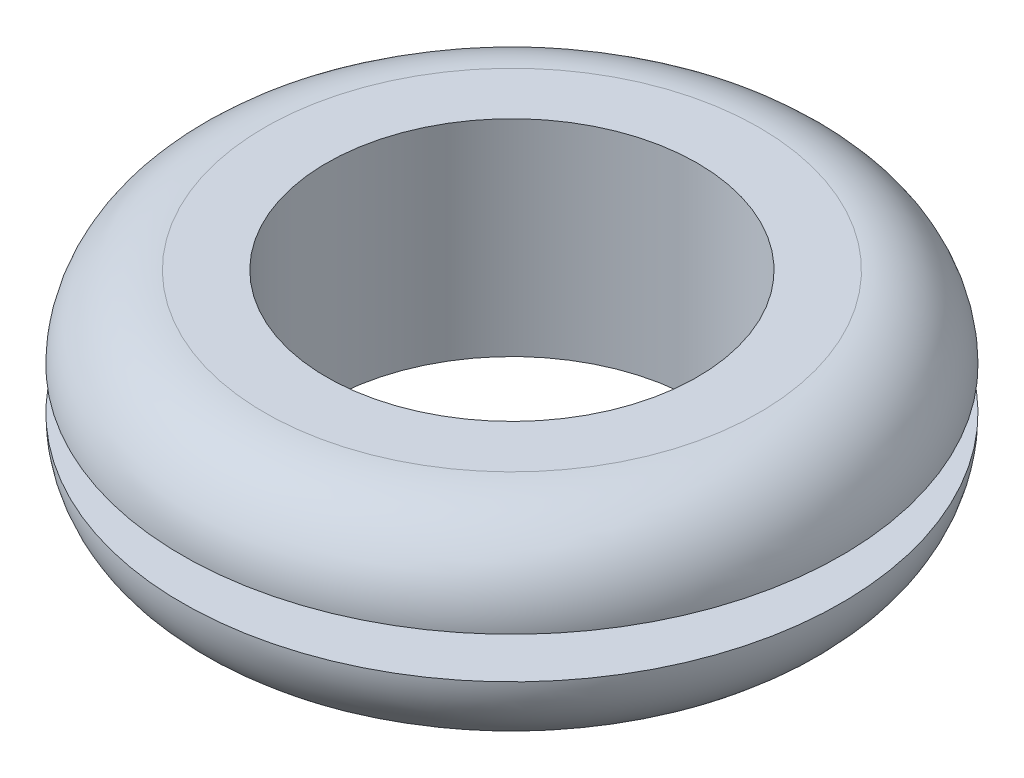
ISO-10303-21;
HEADER;
FILE_DESCRIPTION(('STEP AP214'),'2;1');
FILE_NAME('part.step','',(''),(''),'','','');
FILE_SCHEMA(('AUTOMOTIVE_DESIGN { 1 0 10303 214 1 1 1 1 }'));
ENDSEC;
DATA;
#1=APPLICATION_CONTEXT('core data for automotive mechanical design processes');
#2=APPLICATION_PROTOCOL_DEFINITION('international standard','automotive_design',2000,#1);
#3=PRODUCT_CONTEXT('',#1,'mechanical');
#4=PRODUCT('Part','Part','',(#3));
#5=PRODUCT_RELATED_PRODUCT_CATEGORY('part','',(#4));
#6=PRODUCT_DEFINITION_FORMATION('','',#4);
#7=PRODUCT_DEFINITION_CONTEXT('part definition',#1,'design');
#8=PRODUCT_DEFINITION('design','',#6,#7);
#9=PRODUCT_DEFINITION_SHAPE('','',#8);
#10=(LENGTH_UNIT() NAMED_UNIT(*) SI_UNIT(.MILLI.,.METRE.));
#11=(NAMED_UNIT(*) PLANE_ANGLE_UNIT() SI_UNIT($,.RADIAN.));
#12=(NAMED_UNIT(*) SI_UNIT($,.STERADIAN.) SOLID_ANGLE_UNIT());
#13=UNCERTAINTY_MEASURE_WITH_UNIT(LENGTH_MEASURE(1.E-05),#10,'distance_accuracy_value','');
#14=(GEOMETRIC_REPRESENTATION_CONTEXT(3) GLOBAL_UNCERTAINTY_ASSIGNED_CONTEXT((#13)) GLOBAL_UNIT_ASSIGNED_CONTEXT((#10,
#11,#12)) REPRESENTATION_CONTEXT('',''));
#15=CARTESIAN_POINT('',(0.,0.,0.));
#16=DIRECTION('',(0.,0.,1.));
#17=DIRECTION('',(1.,0.,0.));
#18=AXIS2_PLACEMENT_3D('',#15,#16,#17);
#19=CARTESIAN_POINT('',(0.,-3.96875,7.14375));
#20=DIRECTION('',(0.,1.,0.));
#21=DIRECTION('',(0.,0.,1.));
#22=AXIS2_PLACEMENT_3D('',#19,#20,#21);
#23=PLANE('',#22);
#24=CARTESIAN_POINT('',(0.,-3.96875,0.));
#25=DIRECTION('',(0.,-1.,0.));
#26=DIRECTION('',(0.,0.,-1.));
#27=AXIS2_PLACEMENT_3D('',#24,#25,#26);
#28=CIRCLE('',#27,7.14375);
#29=CARTESIAN_POINT('',(0.,-3.96875,-7.14375));
#30=VERTEX_POINT('',#29);
#31=EDGE_CURVE('E12',#30,#30,#28,.T.);
#32=ORIENTED_EDGE('',*,*,#31,.F.);
#33=EDGE_LOOP('',(#32));
#34=FACE_BOUND('',#33,.T.);
#35=CARTESIAN_POINT('',(0.,-3.96875,0.));
#36=DIRECTION('',(0.,-1.,0.));
#37=DIRECTION('',(0.,0.,-1.));
#38=AXIS2_PLACEMENT_3D('',#35,#36,#37);
#39=CIRCLE('',#38,9.525);
#40=CARTESIAN_POINT('',(0.,-3.96875,-9.525));
#41=VERTEX_POINT('',#40);
#42=EDGE_CURVE('E70',#41,#41,#39,.T.);
#43=ORIENTED_EDGE('',*,*,#42,.T.);
#44=EDGE_LOOP('',(#43));
#45=FACE_BOUND('',#44,.T.);
#46=ADVANCED_FACE('F42',(#34,#45),#23,.F.);
#47=CARTESIAN_POINT('',(0.,-3.96875,0.));
#48=DIRECTION('',(0.,-1.,0.));
#49=DIRECTION('',(0.,0.,-1.));
#50=AXIS2_PLACEMENT_3D('',#47,#48,#49);
#51=CYLINDRICAL_SURFACE('',#50,7.14375);
#52=CARTESIAN_POINT('',(0.,3.96875,0.));
#53=DIRECTION('',(0.,-1.,0.));
#54=DIRECTION('',(0.,0.,-1.));
#55=AXIS2_PLACEMENT_3D('',#52,#53,#54);
#56=CIRCLE('',#55,7.14375);
#57=CARTESIAN_POINT('',(0.,3.96875,-7.14375));
#58=VERTEX_POINT('',#57);
#59=EDGE_CURVE('E48',#58,#58,#56,.T.);
#60=ORIENTED_EDGE('',*,*,#59,.F.);
#61=EDGE_LOOP('',(#60));
#62=FACE_BOUND('',#61,.T.);
#63=ORIENTED_EDGE('',*,*,#31,.T.);
#64=EDGE_LOOP('',(#63));
#65=FACE_BOUND('',#64,.T.);
#66=ADVANCED_FACE('F107',(#62,#65),#51,.F.);
#67=CARTESIAN_POINT('',(0.,3.96875,7.14375));
#68=DIRECTION('',(0.,-1.,0.));
#69=DIRECTION('',(0.,0.,-1.));
#70=AXIS2_PLACEMENT_3D('',#67,#68,#69);
#71=PLANE('',#70);
#72=CARTESIAN_POINT('',(0.,3.96875,0.));
#73=DIRECTION('',(0.,-1.,0.));
#74=DIRECTION('',(0.,0.,-1.));
#75=AXIS2_PLACEMENT_3D('',#72,#73,#74);
#76=CIRCLE('',#75,9.525);
#77=CARTESIAN_POINT('',(0.,3.96875,-9.525));
#78=VERTEX_POINT('',#77);
#79=EDGE_CURVE('E52',#78,#78,#76,.T.);
#80=ORIENTED_EDGE('',*,*,#79,.F.);
#81=EDGE_LOOP('',(#80));
#82=FACE_BOUND('',#81,.T.);
#83=ORIENTED_EDGE('',*,*,#59,.T.);
#84=EDGE_LOOP('',(#83));
#85=FACE_BOUND('',#84,.T.);
#86=ADVANCED_FACE('F102',(#82,#85),#71,.F.);
#87=CARTESIAN_POINT('',(0.,0.793750000000002,0.));
#88=DIRECTION('',(0.,-1.,0.));
#89=DIRECTION('',(0.,0.,-1.));
#90=AXIS2_PLACEMENT_3D('',#87,#88,#89);
#91=TOROIDAL_SURFACE('',#90,9.525,3.175);
#92=CARTESIAN_POINT('',(0.,0.793749999999998,0.));
#93=DIRECTION('',(0.,-1.,0.));
#94=DIRECTION('',(0.,0.,-1.));
#95=AXIS2_PLACEMENT_3D('',#92,#93,#94);
#96=CIRCLE('',#95,12.7);
#97=CARTESIAN_POINT('',(0.,0.793749999999998,-12.7));
#98=VERTEX_POINT('',#97);
#99=EDGE_CURVE('E56',#98,#98,#96,.T.);
#100=ORIENTED_EDGE('',*,*,#99,.F.);
#101=EDGE_LOOP('',(#100));
#102=FACE_BOUND('',#101,.T.);
#103=ORIENTED_EDGE('',*,*,#79,.T.);
#104=EDGE_LOOP('',(#103));
#105=FACE_BOUND('',#104,.T.);
#106=ADVANCED_FACE('F96',(#102,#105),#91,.T.);
#107=CARTESIAN_POINT('',(0.,0.793749999999999,9.525));
#108=DIRECTION('',(0.,1.,0.));
#109=DIRECTION('',(0.,0.,1.));
#110=AXIS2_PLACEMENT_3D('',#107,#108,#109);
#111=PLANE('',#110);
#112=CARTESIAN_POINT('',(0.,0.79375,0.));
#113=DIRECTION('',(0.,-1.,0.));
#114=DIRECTION('',(0.,0.,-1.));
#115=AXIS2_PLACEMENT_3D('',#112,#113,#114);
#116=CIRCLE('',#115,9.525);
#117=CARTESIAN_POINT('',(0.,0.79375,-9.525));
#118=VERTEX_POINT('',#117);
#119=EDGE_CURVE('E61',#118,#118,#116,.T.);
#120=ORIENTED_EDGE('',*,*,#119,.F.);
#121=EDGE_LOOP('',(#120));
#122=FACE_BOUND('',#121,.T.);
#123=ORIENTED_EDGE('',*,*,#99,.T.);
#124=EDGE_LOOP('',(#123));
#125=FACE_BOUND('',#124,.T.);
#126=ADVANCED_FACE('F90',(#122,#125),#111,.F.);
#127=CARTESIAN_POINT('',(0.,-3.96875,0.));
#128=DIRECTION('',(0.,-1.,0.));
#129=DIRECTION('',(0.,0.,-1.));
#130=AXIS2_PLACEMENT_3D('',#127,#128,#129);
#131=CYLINDRICAL_SURFACE('',#130,9.525);
#132=CARTESIAN_POINT('',(0.,-0.79375,0.));
#133=DIRECTION('',(0.,-1.,0.));
#134=DIRECTION('',(0.,0.,-1.));
#135=AXIS2_PLACEMENT_3D('',#132,#133,#134);
#136=CIRCLE('',#135,9.525);
#137=CARTESIAN_POINT('',(0.,-0.79375,-9.525));
#138=VERTEX_POINT('',#137);
#139=EDGE_CURVE('E64',#138,#138,#136,.T.);
#140=ORIENTED_EDGE('',*,*,#139,.F.);
#141=EDGE_LOOP('',(#140));
#142=FACE_BOUND('',#141,.T.);
#143=ORIENTED_EDGE('',*,*,#119,.T.);
#144=EDGE_LOOP('',(#143));
#145=FACE_BOUND('',#144,.T.);
#146=ADVANCED_FACE('F84',(#142,#145),#131,.T.);
#147=CARTESIAN_POINT('',(0.,-0.79375,9.525));
#148=DIRECTION('',(0.,-1.,0.));
#149=DIRECTION('',(0.,0.,-1.));
#150=AXIS2_PLACEMENT_3D('',#147,#148,#149);
#151=PLANE('',#150);
#152=CARTESIAN_POINT('',(0.,-0.79375,0.));
#153=DIRECTION('',(0.,-1.,0.));
#154=DIRECTION('',(0.,0.,-1.));
#155=AXIS2_PLACEMENT_3D('',#152,#153,#154);
#156=CIRCLE('',#155,12.7);
#157=CARTESIAN_POINT('',(0.,-0.79375,-12.7));
#158=VERTEX_POINT('',#157);
#159=EDGE_CURVE('E67',#158,#158,#156,.T.);
#160=ORIENTED_EDGE('',*,*,#159,.F.);
#161=EDGE_LOOP('',(#160));
#162=FACE_BOUND('',#161,.T.);
#163=ORIENTED_EDGE('',*,*,#139,.T.);
#164=EDGE_LOOP('',(#163));
#165=FACE_BOUND('',#164,.T.);
#166=ADVANCED_FACE('F78',(#162,#165),#151,.F.);
#167=CARTESIAN_POINT('',(0.,-0.793750000000002,0.));
#168=DIRECTION('',(0.,-1.,0.));
#169=DIRECTION('',(0.,0.,-1.));
#170=AXIS2_PLACEMENT_3D('',#167,#168,#169);
#171=TOROIDAL_SURFACE('',#170,9.525,3.175);
#172=ORIENTED_EDGE('',*,*,#42,.F.);
#173=EDGE_LOOP('',(#172));
#174=FACE_BOUND('',#173,.T.);
#175=ORIENTED_EDGE('',*,*,#159,.T.);
#176=EDGE_LOOP('',(#175));
#177=FACE_BOUND('',#176,.T.);
#178=ADVANCED_FACE('F75',(#174,#177),#171,.T.);
#179=CLOSED_SHELL('',(#46,#66,#86,#106,#126,#146,#166,#178));
#180=MANIFOLD_SOLID_BREP('B2',#179);
#181=ADVANCED_BREP_SHAPE_REPRESENTATION('',(#18,#180),#14);
#182=SHAPE_DEFINITION_REPRESENTATION(#9,#181);
ENDSEC;
END-ISO-10303-21;
